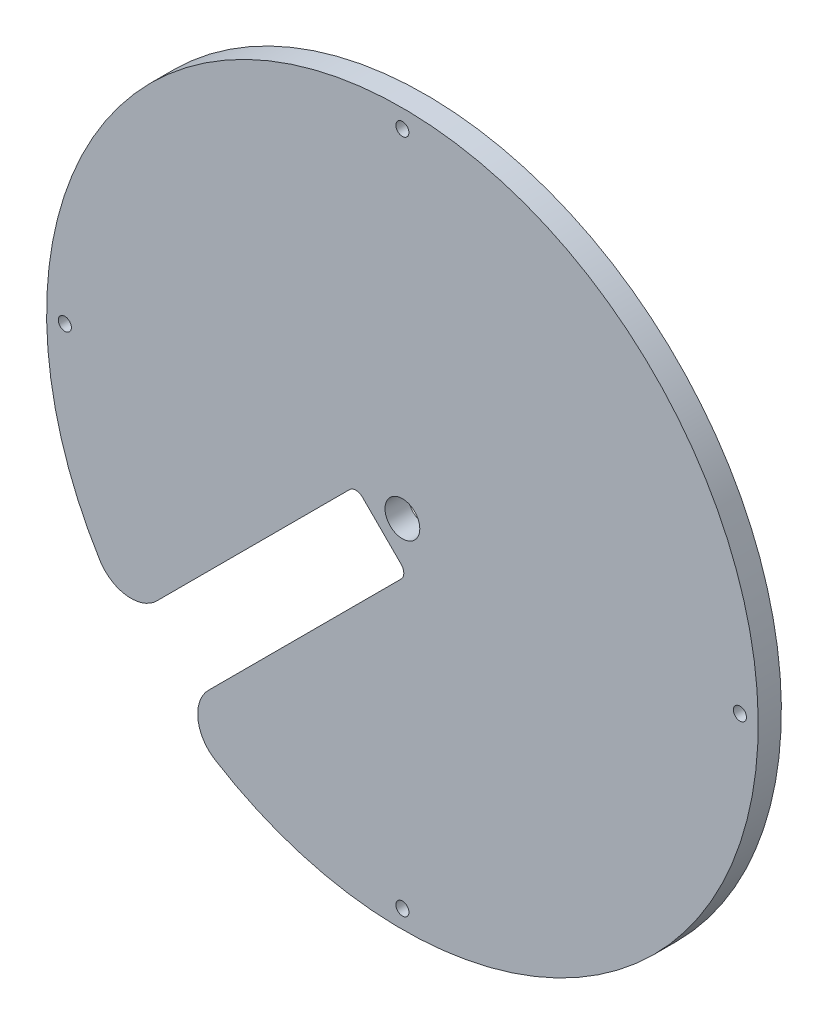
ISO-10303-21;
HEADER;
FILE_DESCRIPTION(('STEP AP214'),'2;1');
FILE_NAME('part.step','',(''),(''),'','','');
FILE_SCHEMA(('AUTOMOTIVE_DESIGN { 1 0 10303 214 1 1 1 1 }'));
ENDSEC;
DATA;
#1=APPLICATION_CONTEXT('core data for automotive mechanical design processes');
#2=APPLICATION_PROTOCOL_DEFINITION('international standard','automotive_design',2000,#1);
#3=PRODUCT_CONTEXT('',#1,'mechanical');
#4=PRODUCT('Part','Part','',(#3));
#5=PRODUCT_RELATED_PRODUCT_CATEGORY('part','',(#4));
#6=PRODUCT_DEFINITION_FORMATION('','',#4);
#7=PRODUCT_DEFINITION_CONTEXT('part definition',#1,'design');
#8=PRODUCT_DEFINITION('design','',#6,#7);
#9=PRODUCT_DEFINITION_SHAPE('','',#8);
#10=(LENGTH_UNIT() NAMED_UNIT(*) SI_UNIT(.MILLI.,.METRE.));
#11=(NAMED_UNIT(*) PLANE_ANGLE_UNIT() SI_UNIT($,.RADIAN.));
#12=(NAMED_UNIT(*) SI_UNIT($,.STERADIAN.) SOLID_ANGLE_UNIT());
#13=UNCERTAINTY_MEASURE_WITH_UNIT(LENGTH_MEASURE(1.E-05),#10,'distance_accuracy_value','');
#14=(GEOMETRIC_REPRESENTATION_CONTEXT(3) GLOBAL_UNCERTAINTY_ASSIGNED_CONTEXT((#13)) GLOBAL_UNIT_ASSIGNED_CONTEXT((#10,
#11,#12)) REPRESENTATION_CONTEXT('',''));
#15=CARTESIAN_POINT('',(0.,0.,0.));
#16=DIRECTION('',(0.,0.,1.));
#17=DIRECTION('',(1.,0.,0.));
#18=AXIS2_PLACEMENT_3D('',#15,#16,#17);
#19=CARTESIAN_POINT('',(0.,0.,6.35));
#20=DIRECTION('',(0.,0.,-1.));
#21=DIRECTION('',(-1.,0.,0.));
#22=AXIS2_PLACEMENT_3D('',#19,#20,#21);
#23=CYLINDRICAL_SURFACE('',#22,97.5);
#24=CARTESIAN_POINT('',(0.,0.,6.35));
#25=DIRECTION('',(0.,0.,1.));
#26=DIRECTION('',(1.,0.,0.));
#27=AXIS2_PLACEMENT_3D('',#24,#25,#26);
#28=CIRCLE('',#27,97.5);
#29=CARTESIAN_POINT('',(-51.359415779716,-82.876175169745,6.35));
#30=VERTEX_POINT('',#29);
#31=CARTESIAN_POINT('',(-82.876175169745,-51.3594157797161,6.35));
#32=VERTEX_POINT('',#31);
#33=EDGE_CURVE('E134',#30,#32,#28,.T.);
#34=ORIENTED_EDGE('',*,*,#33,.F.);
#35=DIRECTION('',(0.,0.,-1.));
#36=VECTOR('',#35,1.);
#37=CARTESIAN_POINT('',(-51.359415779716,-82.876175169745,6.35));
#38=LINE('',#37,#36);
#39=CARTESIAN_POINT('',(-51.359415779716,-82.876175169745,0.));
#40=VERTEX_POINT('',#39);
#41=EDGE_CURVE('E126',#30,#40,#38,.T.);
#42=ORIENTED_EDGE('',*,*,#41,.T.);
#43=CARTESIAN_POINT('',(0.,0.,0.));
#44=DIRECTION('',(0.,0.,1.));
#45=DIRECTION('',(1.,0.,0.));
#46=AXIS2_PLACEMENT_3D('',#43,#44,#45);
#47=CIRCLE('',#46,97.5);
#48=CARTESIAN_POINT('',(-82.876175169745,-51.3594157797161,0.));
#49=VERTEX_POINT('',#48);
#50=EDGE_CURVE('E141',#40,#49,#47,.T.);
#51=ORIENTED_EDGE('',*,*,#50,.T.);
#52=DIRECTION('',(0.,0.,-1.));
#53=VECTOR('',#52,1.);
#54=CARTESIAN_POINT('',(-82.876175169745,-51.3594157797161,6.35));
#55=LINE('',#54,#53);
#56=EDGE_CURVE('E127',#49,#32,#55,.F.);
#57=ORIENTED_EDGE('',*,*,#56,.T.);
#58=EDGE_LOOP('',(#34,#42,#51,#57));
#59=FACE_BOUND('',#58,.T.);
#60=ADVANCED_FACE('F42',(#59),#23,.T.);
#61=CARTESIAN_POINT('',(0.,0.,6.35));
#62=DIRECTION('',(0.,0.,1.));
#63=DIRECTION('',(1.,0.,0.));
#64=AXIS2_PLACEMENT_3D('',#61,#62,#63);
#65=PLANE('',#64);
#66=CARTESIAN_POINT('',(-92.5,0.,6.35));
#67=DIRECTION('',(0.,0.,1.));
#68=DIRECTION('',(1.,0.,0.));
#69=AXIS2_PLACEMENT_3D('',#66,#67,#68);
#70=CIRCLE('',#69,1.7859375);
#71=CARTESIAN_POINT('',(-90.7140625,0.,6.35));
#72=VERTEX_POINT('',#71);
#73=EDGE_CURVE('E183',#72,#72,#70,.T.);
#74=ORIENTED_EDGE('',*,*,#73,.F.);
#75=EDGE_LOOP('',(#74));
#76=FACE_BOUND('',#75,.T.);
#77=CARTESIAN_POINT('',(0.,-92.5,6.35));
#78=DIRECTION('',(0.,0.,1.));
#79=DIRECTION('',(1.,0.,0.));
#80=AXIS2_PLACEMENT_3D('',#77,#78,#79);
#81=CIRCLE('',#80,1.78593750000033);
#82=CARTESIAN_POINT('',(1.78593750000036,-92.5,6.35));
#83=VERTEX_POINT('',#82);
#84=EDGE_CURVE('E186',#83,#83,#81,.T.);
#85=ORIENTED_EDGE('',*,*,#84,.F.);
#86=EDGE_LOOP('',(#85));
#87=FACE_BOUND('',#86,.T.);
#88=CARTESIAN_POINT('',(92.5,0.,6.35));
#89=DIRECTION('',(0.,0.,1.));
#90=DIRECTION('',(1.,0.,0.));
#91=AXIS2_PLACEMENT_3D('',#88,#89,#90);
#92=CIRCLE('',#91,1.78593750000028);
#93=CARTESIAN_POINT('',(94.2859375000003,0.,6.35));
#94=VERTEX_POINT('',#93);
#95=EDGE_CURVE('E189',#94,#94,#92,.T.);
#96=ORIENTED_EDGE('',*,*,#95,.F.);
#97=EDGE_LOOP('',(#96));
#98=FACE_BOUND('',#97,.T.);
#99=CARTESIAN_POINT('',(0.,92.5,6.35));
#100=DIRECTION('',(0.,0.,1.));
#101=DIRECTION('',(1.,0.,0.));
#102=AXIS2_PLACEMENT_3D('',#99,#100,#101);
#103=CIRCLE('',#102,1.78593749999998);
#104=CARTESIAN_POINT('',(1.78593749999998,92.5,6.35));
#105=VERTEX_POINT('',#104);
#106=EDGE_CURVE('E192',#105,#105,#103,.T.);
#107=ORIENTED_EDGE('',*,*,#106,.F.);
#108=EDGE_LOOP('',(#107));
#109=FACE_BOUND('',#108,.T.);
#110=CARTESIAN_POINT('',(0.,0.,6.35));
#111=DIRECTION('',(0.,0.,1.));
#112=DIRECTION('',(1.,0.,0.));
#113=AXIS2_PLACEMENT_3D('',#110,#111,#112);
#114=CIRCLE('',#113,4.7625);
#115=CARTESIAN_POINT('',(4.7625,0.,6.35));
#116=VERTEX_POINT('',#115);
#117=EDGE_CURVE('E138',#116,#116,#114,.T.);
#118=ORIENTED_EDGE('',*,*,#117,.F.);
#119=EDGE_LOOP('',(#118));
#120=FACE_BOUND('',#119,.T.);
#121=DIRECTION('',(0.707106781186548,-0.707106781186548,0.));
#122=VECTOR('',#121,1.);
#123=CARTESIAN_POINT('',(-5.65685424949238,-5.65685424949238,6.35));
#124=LINE('',#123,#122);
#125=CARTESIAN_POINT('',(-10.9601551083915,-0.353553390593285,6.35));
#126=VERTEX_POINT('',#125);
#127=CARTESIAN_POINT('',(-0.353553390593268,-10.9601551083915,6.35));
#128=VERTEX_POINT('',#127);
#129=EDGE_CURVE('E166',#126,#128,#124,.T.);
#130=ORIENTED_EDGE('',*,*,#129,.T.);
#131=CARTESIAN_POINT('',(-2.12132034355964,-12.7279220613579,6.35));
#132=DIRECTION('',(0.,0.,1.));
#133=DIRECTION('',(1.,0.,0.));
#134=AXIS2_PLACEMENT_3D('',#131,#132,#133);
#135=CIRCLE('',#134,2.5);
#136=CARTESIAN_POINT('',(-0.353553390593269,-14.4956890143242,6.35));
#137=VERTEX_POINT('',#136);
#138=EDGE_CURVE('E113',#128,#137,#135,.F.);
#139=ORIENTED_EDGE('',*,*,#138,.T.);
#140=DIRECTION('',(-0.707106781186548,-0.707106781186547,0.));
#141=VECTOR('',#140,1.);
#142=CARTESIAN_POINT('',(7.07106781186548,-7.07106781186548,6.35));
#143=LINE('',#142,#141);
#144=CARTESIAN_POINT('',(-53.1628512039183,-67.3049868276493,6.35));
#145=VERTEX_POINT('',#144);
#146=EDGE_CURVE('E106',#137,#145,#143,.T.);
#147=ORIENTED_EDGE('',*,*,#146,.T.);
#148=CARTESIAN_POINT('',(-46.0917833920528,-74.3760546395147,6.35));
#149=DIRECTION('',(0.,0.,1.));
#150=DIRECTION('',(1.,0.,0.));
#151=AXIS2_PLACEMENT_3D('',#148,#149,#150);
#152=CIRCLE('',#151,10.);
#153=EDGE_CURVE('E111',#145,#30,#152,.T.);
#154=ORIENTED_EDGE('',*,*,#153,.T.);
#155=ORIENTED_EDGE('',*,*,#33,.T.);
#156=CARTESIAN_POINT('',(-74.3760546395147,-46.0917833920529,6.35));
#157=DIRECTION('',(0.,0.,1.));
#158=DIRECTION('',(1.,0.,0.));
#159=AXIS2_PLACEMENT_3D('',#156,#157,#158);
#160=CIRCLE('',#159,10.);
#161=CARTESIAN_POINT('',(-67.3049868276493,-53.1628512039184,6.35));
#162=VERTEX_POINT('',#161);
#163=EDGE_CURVE('E128',#32,#162,#160,.T.);
#164=ORIENTED_EDGE('',*,*,#163,.T.);
#165=DIRECTION('',(-0.707106781186547,-0.707106781186548,0.));
#166=VECTOR('',#165,1.);
#167=CARTESIAN_POINT('',(-7.07106781186546,7.07106781186546,6.35));
#168=LINE('',#167,#166);
#169=CARTESIAN_POINT('',(-14.4956890143242,-0.353553390593288,6.35));
#170=VERTEX_POINT('',#169);
#171=EDGE_CURVE('E118',#170,#162,#168,.T.);
#172=ORIENTED_EDGE('',*,*,#171,.F.);
#173=CARTESIAN_POINT('',(-12.7279220613578,-2.12132034355966,6.35));
#174=DIRECTION('',(0.,0.,1.));
#175=DIRECTION('',(1.,0.,0.));
#176=AXIS2_PLACEMENT_3D('',#173,#174,#175);
#177=CIRCLE('',#176,2.5);
#178=EDGE_CURVE('E50',#170,#126,#177,.F.);
#179=ORIENTED_EDGE('',*,*,#178,.T.);
#180=EDGE_LOOP('',(#130,#139,#147,#154,#155,#164,#172,#179));
#181=FACE_BOUND('',#180,.T.);
#182=ADVANCED_FACE('F109',(#76,#87,#98,#109,#120,#181),#65,.T.);
#183=CARTESIAN_POINT('',(0.,0.,0.));
#184=DIRECTION('',(0.,0.,1.));
#185=DIRECTION('',(1.,0.,0.));
#186=AXIS2_PLACEMENT_3D('',#183,#184,#185);
#187=PLANE('',#186);
#188=CARTESIAN_POINT('',(0.,0.,0.));
#189=DIRECTION('',(0.,0.,1.));
#190=DIRECTION('',(1.,0.,0.));
#191=AXIS2_PLACEMENT_3D('',#188,#189,#190);
#192=CIRCLE('',#191,4.7625);
#193=CARTESIAN_POINT('',(4.7625,0.,0.));
#194=VERTEX_POINT('',#193);
#195=EDGE_CURVE('E204',#194,#194,#192,.T.);
#196=ORIENTED_EDGE('',*,*,#195,.T.);
#197=EDGE_LOOP('',(#196));
#198=FACE_BOUND('',#197,.T.);
#199=CARTESIAN_POINT('',(0.,92.5,0.));
#200=DIRECTION('',(0.,0.,1.));
#201=DIRECTION('',(1.,0.,0.));
#202=AXIS2_PLACEMENT_3D('',#199,#200,#201);
#203=CIRCLE('',#202,1.78593749999998);
#204=CARTESIAN_POINT('',(1.78593749999998,92.5,0.));
#205=VERTEX_POINT('',#204);
#206=EDGE_CURVE('E202',#205,#205,#203,.T.);
#207=ORIENTED_EDGE('',*,*,#206,.T.);
#208=EDGE_LOOP('',(#207));
#209=FACE_BOUND('',#208,.T.);
#210=CARTESIAN_POINT('',(92.5,0.,0.));
#211=DIRECTION('',(0.,0.,1.));
#212=DIRECTION('',(1.,0.,0.));
#213=AXIS2_PLACEMENT_3D('',#210,#211,#212);
#214=CIRCLE('',#213,1.78593750000028);
#215=CARTESIAN_POINT('',(94.2859375000003,0.,0.));
#216=VERTEX_POINT('',#215);
#217=EDGE_CURVE('E199',#216,#216,#214,.T.);
#218=ORIENTED_EDGE('',*,*,#217,.T.);
#219=EDGE_LOOP('',(#218));
#220=FACE_BOUND('',#219,.T.);
#221=CARTESIAN_POINT('',(0.,-92.5,0.));
#222=DIRECTION('',(0.,0.,1.));
#223=DIRECTION('',(1.,0.,0.));
#224=AXIS2_PLACEMENT_3D('',#221,#222,#223);
#225=CIRCLE('',#224,1.78593750000033);
#226=CARTESIAN_POINT('',(1.78593750000036,-92.5,0.));
#227=VERTEX_POINT('',#226);
#228=EDGE_CURVE('E179',#227,#227,#225,.T.);
#229=ORIENTED_EDGE('',*,*,#228,.T.);
#230=EDGE_LOOP('',(#229));
#231=FACE_BOUND('',#230,.T.);
#232=CARTESIAN_POINT('',(-92.5,0.,0.));
#233=DIRECTION('',(0.,0.,1.));
#234=DIRECTION('',(1.,0.,0.));
#235=AXIS2_PLACEMENT_3D('',#232,#233,#234);
#236=CIRCLE('',#235,1.7859375);
#237=CARTESIAN_POINT('',(-90.7140625,0.,0.));
#238=VERTEX_POINT('',#237);
#239=EDGE_CURVE('E176',#238,#238,#236,.T.);
#240=ORIENTED_EDGE('',*,*,#239,.T.);
#241=EDGE_LOOP('',(#240));
#242=FACE_BOUND('',#241,.T.);
#243=ORIENTED_EDGE('',*,*,#50,.F.);
#244=CARTESIAN_POINT('',(-46.0917833920528,-74.3760546395147,0.));
#245=DIRECTION('',(0.,0.,1.));
#246=DIRECTION('',(1.,0.,0.));
#247=AXIS2_PLACEMENT_3D('',#244,#245,#246);
#248=CIRCLE('',#247,10.);
#249=CARTESIAN_POINT('',(-53.1628512039183,-67.3049868276493,0.));
#250=VERTEX_POINT('',#249);
#251=EDGE_CURVE('E149',#40,#250,#248,.F.);
#252=ORIENTED_EDGE('',*,*,#251,.T.);
#253=DIRECTION('',(0.707106781186548,0.707106781186548,0.));
#254=VECTOR('',#253,1.);
#255=CARTESIAN_POINT('',(7.07106781186548,-7.07106781186548,0.));
#256=LINE('',#255,#254);
#257=CARTESIAN_POINT('',(-0.353553390593269,-14.4956890143242,0.));
#258=VERTEX_POINT('',#257);
#259=EDGE_CURVE('E133',#250,#258,#256,.T.);
#260=ORIENTED_EDGE('',*,*,#259,.T.);
#261=CARTESIAN_POINT('',(-2.12132034355964,-12.7279220613579,0.));
#262=DIRECTION('',(0.,0.,1.));
#263=DIRECTION('',(1.,0.,0.));
#264=AXIS2_PLACEMENT_3D('',#261,#262,#263);
#265=CIRCLE('',#264,2.5);
#266=CARTESIAN_POINT('',(-0.353553390593268,-10.9601551083915,0.));
#267=VERTEX_POINT('',#266);
#268=EDGE_CURVE('E163',#258,#267,#265,.T.);
#269=ORIENTED_EDGE('',*,*,#268,.T.);
#270=DIRECTION('',(-0.707106781186548,0.707106781186548,0.));
#271=VECTOR('',#270,1.);
#272=CARTESIAN_POINT('',(-5.65685424949238,-5.65685424949238,0.));
#273=LINE('',#272,#271);
#274=CARTESIAN_POINT('',(-10.9601551083915,-0.353553390593285,0.));
#275=VERTEX_POINT('',#274);
#276=EDGE_CURVE('E258',#267,#275,#273,.T.);
#277=ORIENTED_EDGE('',*,*,#276,.T.);
#278=CARTESIAN_POINT('',(-12.7279220613578,-2.12132034355966,0.));
#279=DIRECTION('',(0.,0.,1.));
#280=DIRECTION('',(1.,0.,0.));
#281=AXIS2_PLACEMENT_3D('',#278,#279,#280);
#282=CIRCLE('',#281,2.5);
#283=CARTESIAN_POINT('',(-14.4956890143242,-0.353553390593288,0.));
#284=VERTEX_POINT('',#283);
#285=EDGE_CURVE('E11',#275,#284,#282,.T.);
#286=ORIENTED_EDGE('',*,*,#285,.T.);
#287=DIRECTION('',(0.707106781186547,0.707106781186548,0.));
#288=VECTOR('',#287,1.);
#289=CARTESIAN_POINT('',(-7.07106781186546,7.07106781186546,0.));
#290=LINE('',#289,#288);
#291=CARTESIAN_POINT('',(-67.3049868276493,-53.1628512039184,0.));
#292=VERTEX_POINT('',#291);
#293=EDGE_CURVE('E117',#292,#284,#290,.T.);
#294=ORIENTED_EDGE('',*,*,#293,.F.);
#295=CARTESIAN_POINT('',(-74.3760546395147,-46.0917833920529,0.));
#296=DIRECTION('',(0.,0.,1.));
#297=DIRECTION('',(1.,0.,0.));
#298=AXIS2_PLACEMENT_3D('',#295,#296,#297);
#299=CIRCLE('',#298,10.);
#300=EDGE_CURVE('E147',#292,#49,#299,.F.);
#301=ORIENTED_EDGE('',*,*,#300,.T.);
#302=EDGE_LOOP('',(#243,#252,#260,#269,#277,#286,#294,#301));
#303=FACE_BOUND('',#302,.T.);
#304=ADVANCED_FACE('F214',(#198,#209,#220,#231,#242,#303),#187,.F.);
#305=CARTESIAN_POINT('',(0.,0.,6.35));
#306=DIRECTION('',(0.,0.,-1.));
#307=DIRECTION('',(-1.,0.,0.));
#308=AXIS2_PLACEMENT_3D('',#305,#306,#307);
#309=CYLINDRICAL_SURFACE('',#308,4.7625);
#310=ORIENTED_EDGE('',*,*,#117,.T.);
#311=EDGE_LOOP('',(#310));
#312=FACE_BOUND('',#311,.T.);
#313=ORIENTED_EDGE('',*,*,#195,.F.);
#314=EDGE_LOOP('',(#313));
#315=FACE_BOUND('',#314,.T.);
#316=ADVANCED_FACE('F216',(#312,#315),#309,.F.);
#317=CARTESIAN_POINT('',(0.,92.5,6.35));
#318=DIRECTION('',(0.,0.,-1.));
#319=DIRECTION('',(-1.,0.,0.));
#320=AXIS2_PLACEMENT_3D('',#317,#318,#319);
#321=CYLINDRICAL_SURFACE('',#320,1.78593749999998);
#322=ORIENTED_EDGE('',*,*,#106,.T.);
#323=EDGE_LOOP('',(#322));
#324=FACE_BOUND('',#323,.T.);
#325=ORIENTED_EDGE('',*,*,#206,.F.);
#326=EDGE_LOOP('',(#325));
#327=FACE_BOUND('',#326,.T.);
#328=ADVANCED_FACE('F222',(#324,#327),#321,.F.);
#329=CARTESIAN_POINT('',(92.5,0.,6.35));
#330=DIRECTION('',(0.,0.,-1.));
#331=DIRECTION('',(-1.,0.,0.));
#332=AXIS2_PLACEMENT_3D('',#329,#330,#331);
#333=CYLINDRICAL_SURFACE('',#332,1.78593750000028);
#334=ORIENTED_EDGE('',*,*,#95,.T.);
#335=EDGE_LOOP('',(#334));
#336=FACE_BOUND('',#335,.T.);
#337=ORIENTED_EDGE('',*,*,#217,.F.);
#338=EDGE_LOOP('',(#337));
#339=FACE_BOUND('',#338,.T.);
#340=ADVANCED_FACE('F235',(#336,#339),#333,.F.);
#341=CARTESIAN_POINT('',(0.,-92.5,6.35));
#342=DIRECTION('',(0.,0.,-1.));
#343=DIRECTION('',(-1.,0.,0.));
#344=AXIS2_PLACEMENT_3D('',#341,#342,#343);
#345=CYLINDRICAL_SURFACE('',#344,1.78593750000033);
#346=ORIENTED_EDGE('',*,*,#84,.T.);
#347=EDGE_LOOP('',(#346));
#348=FACE_BOUND('',#347,.T.);
#349=ORIENTED_EDGE('',*,*,#228,.F.);
#350=EDGE_LOOP('',(#349));
#351=FACE_BOUND('',#350,.T.);
#352=ADVANCED_FACE('F239',(#348,#351),#345,.F.);
#353=CARTESIAN_POINT('',(-92.5,0.,6.35));
#354=DIRECTION('',(0.,0.,-1.));
#355=DIRECTION('',(-1.,0.,0.));
#356=AXIS2_PLACEMENT_3D('',#353,#354,#355);
#357=CYLINDRICAL_SURFACE('',#356,1.7859375);
#358=ORIENTED_EDGE('',*,*,#73,.T.);
#359=EDGE_LOOP('',(#358));
#360=FACE_BOUND('',#359,.T.);
#361=ORIENTED_EDGE('',*,*,#239,.F.);
#362=EDGE_LOOP('',(#361));
#363=FACE_BOUND('',#362,.T.);
#364=ADVANCED_FACE('F243',(#360,#363),#357,.F.);
#365=CARTESIAN_POINT('',(-5.65685424949238,-5.65685424949238,-0.00100000000000013));
#366=DIRECTION('',(-0.707106781186548,-0.707106781186548,0.));
#367=DIRECTION('',(0.707106781186548,-0.707106781186548,0.));
#368=AXIS2_PLACEMENT_3D('',#365,#366,#367);
#369=PLANE('',#368);
#370=ORIENTED_EDGE('',*,*,#276,.F.);
#371=DIRECTION('',(0.,0.,1.));
#372=VECTOR('',#371,1.);
#373=CARTESIAN_POINT('',(-0.353553390593269,-10.9601551083915,6.35));
#374=LINE('',#373,#372);
#375=EDGE_CURVE('E155',#267,#128,#374,.T.);
#376=ORIENTED_EDGE('',*,*,#375,.T.);
#377=ORIENTED_EDGE('',*,*,#129,.F.);
#378=DIRECTION('',(0.,0.,1.));
#379=VECTOR('',#378,1.);
#380=CARTESIAN_POINT('',(-10.9601551083915,-0.353553390593286,-0.00100000000000013));
#381=LINE('',#380,#379);
#382=EDGE_CURVE('E153',#126,#275,#381,.F.);
#383=ORIENTED_EDGE('',*,*,#382,.T.);
#384=EDGE_LOOP('',(#370,#376,#377,#383));
#385=FACE_BOUND('',#384,.T.);
#386=ADVANCED_FACE('F169',(#385),#369,.T.);
#387=CARTESIAN_POINT('',(7.07106781186548,-7.07106781186548,-0.00100000000000013));
#388=DIRECTION('',(-0.707106781186548,0.707106781186548,0.));
#389=DIRECTION('',(-0.707106781186548,-0.707106781186548,0.));
#390=AXIS2_PLACEMENT_3D('',#387,#388,#389);
#391=PLANE('',#390);
#392=ORIENTED_EDGE('',*,*,#146,.F.);
#393=DIRECTION('',(0.,0.,1.));
#394=VECTOR('',#393,1.);
#395=CARTESIAN_POINT('',(-0.353553390593268,-14.4956890143242,0.));
#396=LINE('',#395,#394);
#397=EDGE_CURVE('E158',#137,#258,#396,.F.);
#398=ORIENTED_EDGE('',*,*,#397,.T.);
#399=ORIENTED_EDGE('',*,*,#259,.F.);
#400=DIRECTION('',(0.,0.,1.));
#401=VECTOR('',#400,1.);
#402=CARTESIAN_POINT('',(-53.1628512039183,-67.3049868276493,6.35));
#403=LINE('',#402,#401);
#404=EDGE_CURVE('E125',#250,#145,#403,.T.);
#405=ORIENTED_EDGE('',*,*,#404,.T.);
#406=EDGE_LOOP('',(#392,#398,#399,#405));
#407=FACE_BOUND('',#406,.T.);
#408=ADVANCED_FACE('F131',(#407),#391,.T.);
#409=CARTESIAN_POINT('',(-7.07106781186546,7.07106781186546,-0.00100000000000013));
#410=DIRECTION('',(-0.707106781186548,0.707106781186547,0.));
#411=DIRECTION('',(-0.707106781186547,-0.707106781186548,0.));
#412=AXIS2_PLACEMENT_3D('',#409,#410,#411);
#413=PLANE('',#412);
#414=ORIENTED_EDGE('',*,*,#293,.T.);
#415=DIRECTION('',(0.,0.,1.));
#416=VECTOR('',#415,1.);
#417=CARTESIAN_POINT('',(-14.4956890143242,-0.353553390593288,-0.00100000000000013));
#418=LINE('',#417,#416);
#419=EDGE_CURVE('E160',#284,#170,#418,.T.);
#420=ORIENTED_EDGE('',*,*,#419,.T.);
#421=ORIENTED_EDGE('',*,*,#171,.T.);
#422=DIRECTION('',(0.,0.,-1.));
#423=VECTOR('',#422,1.);
#424=CARTESIAN_POINT('',(-67.3049868276493,-53.1628512039184,-0.00100000000000013));
#425=LINE('',#424,#423);
#426=EDGE_CURVE('E151',#162,#292,#425,.T.);
#427=ORIENTED_EDGE('',*,*,#426,.T.);
#428=EDGE_LOOP('',(#414,#420,#421,#427));
#429=FACE_BOUND('',#428,.T.);
#430=ADVANCED_FACE('F173',(#429),#413,.F.);
#431=CARTESIAN_POINT('',(-46.0917833920528,-74.3760546395147,6.35));
#432=DIRECTION('',(0.,0.,-1.));
#433=DIRECTION('',(-1.,0.,0.));
#434=AXIS2_PLACEMENT_3D('',#431,#432,#433);
#435=CYLINDRICAL_SURFACE('',#434,10.);
#436=ORIENTED_EDGE('',*,*,#251,.F.);
#437=ORIENTED_EDGE('',*,*,#41,.F.);
#438=ORIENTED_EDGE('',*,*,#153,.F.);
#439=ORIENTED_EDGE('',*,*,#404,.F.);
#440=EDGE_LOOP('',(#436,#437,#438,#439));
#441=FACE_BOUND('',#440,.T.);
#442=ADVANCED_FACE('F124',(#441),#435,.T.);
#443=CARTESIAN_POINT('',(-74.3760546395147,-46.0917833920529,6.35));
#444=DIRECTION('',(0.,0.,-1.));
#445=DIRECTION('',(-1.,0.,0.));
#446=AXIS2_PLACEMENT_3D('',#443,#444,#445);
#447=CYLINDRICAL_SURFACE('',#446,10.);
#448=ORIENTED_EDGE('',*,*,#300,.F.);
#449=ORIENTED_EDGE('',*,*,#426,.F.);
#450=ORIENTED_EDGE('',*,*,#163,.F.);
#451=ORIENTED_EDGE('',*,*,#56,.F.);
#452=EDGE_LOOP('',(#448,#449,#450,#451));
#453=FACE_BOUND('',#452,.T.);
#454=ADVANCED_FACE('F213',(#453),#447,.T.);
#455=CARTESIAN_POINT('',(-2.12132034355964,-12.7279220613579,-0.00100000000000013));
#456=DIRECTION('',(0.,0.,-1.));
#457=DIRECTION('',(-1.,0.,0.));
#458=AXIS2_PLACEMENT_3D('',#455,#456,#457);
#459=CYLINDRICAL_SURFACE('',#458,2.5);
#460=ORIENTED_EDGE('',*,*,#268,.F.);
#461=ORIENTED_EDGE('',*,*,#397,.F.);
#462=ORIENTED_EDGE('',*,*,#138,.F.);
#463=ORIENTED_EDGE('',*,*,#375,.F.);
#464=EDGE_LOOP('',(#460,#461,#462,#463));
#465=FACE_BOUND('',#464,.T.);
#466=ADVANCED_FACE('F251',(#465),#459,.F.);
#467=CARTESIAN_POINT('',(-12.7279220613578,-2.12132034355966,-0.00100000000000013));
#468=DIRECTION('',(0.,0.,1.));
#469=DIRECTION('',(1.,0.,0.));
#470=AXIS2_PLACEMENT_3D('',#467,#468,#469);
#471=CYLINDRICAL_SURFACE('',#470,2.5);
#472=ORIENTED_EDGE('',*,*,#285,.F.);
#473=ORIENTED_EDGE('',*,*,#382,.F.);
#474=ORIENTED_EDGE('',*,*,#178,.F.);
#475=ORIENTED_EDGE('',*,*,#419,.F.);
#476=EDGE_LOOP('',(#472,#473,#474,#475));
#477=FACE_BOUND('',#476,.T.);
#478=ADVANCED_FACE('F44',(#477),#471,.F.);
#479=CLOSED_SHELL('',(#60,#182,#304,#316,#328,#340,#352,#364,#386,#408,#430,#442,#454,#466,#478));
#480=MANIFOLD_SOLID_BREP('B2',#479);
#481=ADVANCED_BREP_SHAPE_REPRESENTATION('',(#18,#480),#14);
#482=SHAPE_DEFINITION_REPRESENTATION(#9,#481);
ENDSEC;
END-ISO-10303-21;
